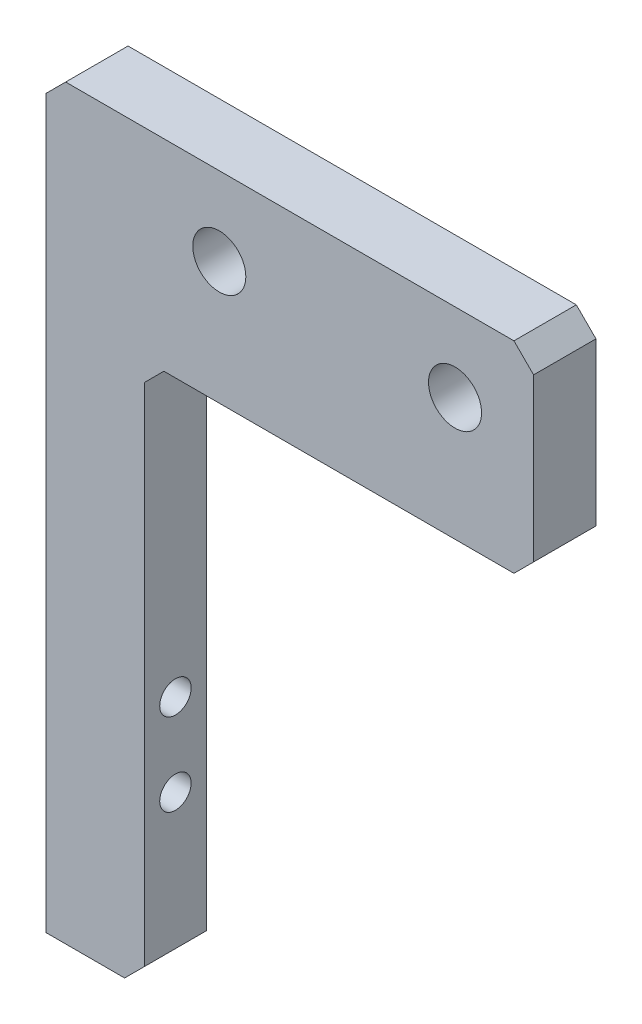
ISO-10303-21;
HEADER;
FILE_DESCRIPTION(('STEP AP214'),'2;1');
FILE_NAME('part.step','',(''),(''),'','','');
FILE_SCHEMA(('AUTOMOTIVE_DESIGN { 1 0 10303 214 1 1 1 1 }'));
ENDSEC;
DATA;
#1=APPLICATION_CONTEXT('core data for automotive mechanical design processes');
#2=APPLICATION_PROTOCOL_DEFINITION('international standard','automotive_design',2000,#1);
#3=PRODUCT_CONTEXT('',#1,'mechanical');
#4=PRODUCT('Part','Part','',(#3));
#5=PRODUCT_RELATED_PRODUCT_CATEGORY('part','',(#4));
#6=PRODUCT_DEFINITION_FORMATION('','',#4);
#7=PRODUCT_DEFINITION_CONTEXT('part definition',#1,'design');
#8=PRODUCT_DEFINITION('design','',#6,#7);
#9=PRODUCT_DEFINITION_SHAPE('','',#8);
#10=(LENGTH_UNIT() NAMED_UNIT(*) SI_UNIT(.MILLI.,.METRE.));
#11=(NAMED_UNIT(*) PLANE_ANGLE_UNIT() SI_UNIT($,.RADIAN.));
#12=(NAMED_UNIT(*) SI_UNIT($,.STERADIAN.) SOLID_ANGLE_UNIT());
#13=UNCERTAINTY_MEASURE_WITH_UNIT(LENGTH_MEASURE(1.E-05),#10,'distance_accuracy_value','');
#14=(GEOMETRIC_REPRESENTATION_CONTEXT(3) GLOBAL_UNCERTAINTY_ASSIGNED_CONTEXT((#13)) GLOBAL_UNIT_ASSIGNED_CONTEXT((#10,
#11,#12)) REPRESENTATION_CONTEXT('',''));
#15=CARTESIAN_POINT('',(0.,0.,0.));
#16=DIRECTION('',(0.,0.,1.));
#17=DIRECTION('',(1.,0.,0.));
#18=AXIS2_PLACEMENT_3D('',#15,#16,#17);
#19=CARTESIAN_POINT('',(-9.81999999999999,-34.,3.175));
#20=DIRECTION('',(-1.,0.,0.));
#21=DIRECTION('',(0.,0.,1.));
#22=AXIS2_PLACEMENT_3D('',#19,#20,#21);
#23=PLANE('',#22);
#24=CARTESIAN_POINT('',(-9.81999999999999,-21.9,1.5875));
#25=DIRECTION('',(-1.,0.,0.));
#26=DIRECTION('',(0.,0.,1.));
#27=AXIS2_PLACEMENT_3D('',#24,#25,#26);
#28=CIRCLE('',#27,0.799999999999997);
#29=CARTESIAN_POINT('',(-9.81999999999999,-21.9,2.3875));
#30=VERTEX_POINT('',#29);
#31=EDGE_CURVE('E286',#30,#30,#28,.T.);
#32=ORIENTED_EDGE('',*,*,#31,.T.);
#33=EDGE_LOOP('',(#32));
#34=FACE_BOUND('',#33,.T.);
#35=CARTESIAN_POINT('',(-9.81999999999999,-26.1,1.5875));
#36=DIRECTION('',(-1.,0.,0.));
#37=DIRECTION('',(0.,0.,1.));
#38=AXIS2_PLACEMENT_3D('',#35,#36,#37);
#39=CIRCLE('',#38,0.799999999999997);
#40=CARTESIAN_POINT('',(-9.81999999999999,-26.1,2.3875));
#41=VERTEX_POINT('',#40);
#42=EDGE_CURVE('E290',#41,#41,#39,.T.);
#43=ORIENTED_EDGE('',*,*,#42,.T.);
#44=EDGE_LOOP('',(#43));
#45=FACE_BOUND('',#44,.T.);
#46=DIRECTION('',(0.,1.,0.));
#47=VECTOR('',#46,1.);
#48=CARTESIAN_POINT('',(-9.81999999999999,-34.,3.175));
#49=LINE('',#48,#47);
#50=CARTESIAN_POINT('',(-9.81999999999999,-33.,3.175));
#51=VERTEX_POINT('',#50);
#52=CARTESIAN_POINT('',(-9.81999999999999,-7.25,3.175));
#53=VERTEX_POINT('',#52);
#54=EDGE_CURVE('E159',#51,#53,#49,.T.);
#55=ORIENTED_EDGE('',*,*,#54,.F.);
#56=DIRECTION('',(0.,0.,-1.));
#57=VECTOR('',#56,1.);
#58=CARTESIAN_POINT('',(-9.81999999999999,-33.,3.175));
#59=LINE('',#58,#57);
#60=CARTESIAN_POINT('',(-9.81999999999999,-33.,0.));
#61=VERTEX_POINT('',#60);
#62=EDGE_CURVE('E162',#51,#61,#59,.T.);
#63=ORIENTED_EDGE('',*,*,#62,.T.);
#64=DIRECTION('',(0.,1.,0.));
#65=VECTOR('',#64,1.);
#66=CARTESIAN_POINT('',(-9.81999999999999,-34.,0.));
#67=LINE('',#66,#65);
#68=CARTESIAN_POINT('',(-9.81999999999999,-7.25,0.));
#69=VERTEX_POINT('',#68);
#70=EDGE_CURVE('E145',#61,#69,#67,.T.);
#71=ORIENTED_EDGE('',*,*,#70,.T.);
#72=DIRECTION('',(0.,0.,1.));
#73=VECTOR('',#72,1.);
#74=CARTESIAN_POINT('',(-9.81999999999999,-7.25,3.175));
#75=LINE('',#74,#73);
#76=EDGE_CURVE('E137',#69,#53,#75,.T.);
#77=ORIENTED_EDGE('',*,*,#76,.T.);
#78=EDGE_LOOP('',(#55,#63,#71,#77));
#79=FACE_BOUND('',#78,.T.);
#80=ADVANCED_FACE('F35',(#34,#45,#79),#23,.F.);
#81=CARTESIAN_POINT('',(-9.81999999999999,-6.25,3.175));
#82=DIRECTION('',(0.,1.,0.));
#83=DIRECTION('',(0.,0.,1.));
#84=AXIS2_PLACEMENT_3D('',#81,#82,#83);
#85=PLANE('',#84);
#86=DIRECTION('',(1.,0.,0.));
#87=VECTOR('',#86,1.);
#88=CARTESIAN_POINT('',(-9.81999999999999,-6.25,3.175));
#89=LINE('',#88,#87);
#90=CARTESIAN_POINT('',(-8.81999999999998,-6.25,3.175));
#91=VERTEX_POINT('',#90);
#92=CARTESIAN_POINT('',(9.,-6.25,3.175));
#93=VERTEX_POINT('',#92);
#94=EDGE_CURVE('E211',#91,#93,#89,.T.);
#95=ORIENTED_EDGE('',*,*,#94,.F.);
#96=DIRECTION('',(0.,0.,-1.));
#97=VECTOR('',#96,1.);
#98=CARTESIAN_POINT('',(-8.81999999999998,-6.25,0.));
#99=LINE('',#98,#97);
#100=CARTESIAN_POINT('',(-8.81999999999998,-6.25,0.));
#101=VERTEX_POINT('',#100);
#102=EDGE_CURVE('E183',#91,#101,#99,.T.);
#103=ORIENTED_EDGE('',*,*,#102,.T.);
#104=DIRECTION('',(1.,0.,0.));
#105=VECTOR('',#104,1.);
#106=CARTESIAN_POINT('',(-9.81999999999999,-6.25,0.));
#107=LINE('',#106,#105);
#108=CARTESIAN_POINT('',(9.,-6.25,0.));
#109=VERTEX_POINT('',#108);
#110=EDGE_CURVE('E148',#101,#109,#107,.T.);
#111=ORIENTED_EDGE('',*,*,#110,.T.);
#112=DIRECTION('',(0.,0.,1.));
#113=VECTOR('',#112,1.);
#114=CARTESIAN_POINT('',(9.,-6.25,3.175));
#115=LINE('',#114,#113);
#116=EDGE_CURVE('E181',#109,#93,#115,.T.);
#117=ORIENTED_EDGE('',*,*,#116,.T.);
#118=EDGE_LOOP('',(#95,#103,#111,#117));
#119=FACE_BOUND('',#118,.T.);
#120=ADVANCED_FACE('F214',(#119),#85,.F.);
#121=CARTESIAN_POINT('',(10.,-6.25,3.175));
#122=DIRECTION('',(-1.,0.,0.));
#123=DIRECTION('',(0.,-1.,0.));
#124=AXIS2_PLACEMENT_3D('',#121,#122,#123);
#125=PLANE('',#124);
#126=DIRECTION('',(0.,1.,0.));
#127=VECTOR('',#126,1.);
#128=CARTESIAN_POINT('',(10.,-6.25,0.));
#129=LINE('',#128,#127);
#130=CARTESIAN_POINT('',(10.,-5.25,0.));
#131=VERTEX_POINT('',#130);
#132=CARTESIAN_POINT('',(10.,3.,0.));
#133=VERTEX_POINT('',#132);
#134=EDGE_CURVE('E152',#131,#133,#129,.T.);
#135=ORIENTED_EDGE('',*,*,#134,.T.);
#136=DIRECTION('',(0.,0.,1.));
#137=VECTOR('',#136,1.);
#138=CARTESIAN_POINT('',(10.,3.,3.175));
#139=LINE('',#138,#137);
#140=CARTESIAN_POINT('',(10.,3.,3.175));
#141=VERTEX_POINT('',#140);
#142=EDGE_CURVE('E195',#133,#141,#139,.T.);
#143=ORIENTED_EDGE('',*,*,#142,.T.);
#144=DIRECTION('',(0.,1.,0.));
#145=VECTOR('',#144,1.);
#146=CARTESIAN_POINT('',(10.,-6.25,3.175));
#147=LINE('',#146,#145);
#148=CARTESIAN_POINT('',(10.,-5.25,3.175));
#149=VERTEX_POINT('',#148);
#150=EDGE_CURVE('E216',#149,#141,#147,.T.);
#151=ORIENTED_EDGE('',*,*,#150,.F.);
#152=DIRECTION('',(0.,0.,-1.));
#153=VECTOR('',#152,1.);
#154=CARTESIAN_POINT('',(10.,-5.25,3.175));
#155=LINE('',#154,#153);
#156=EDGE_CURVE('E192',#149,#131,#155,.T.);
#157=ORIENTED_EDGE('',*,*,#156,.T.);
#158=EDGE_LOOP('',(#135,#143,#151,#157));
#159=FACE_BOUND('',#158,.T.);
#160=ADVANCED_FACE('F247',(#159),#125,.F.);
#161=CARTESIAN_POINT('',(10.,4.,3.175));
#162=DIRECTION('',(0.,-1.,0.));
#163=DIRECTION('',(1.,0.,0.));
#164=AXIS2_PLACEMENT_3D('',#161,#162,#163);
#165=PLANE('',#164);
#166=DIRECTION('',(-1.,0.,0.));
#167=VECTOR('',#166,1.);
#168=CARTESIAN_POINT('',(10.,4.,0.));
#169=LINE('',#168,#167);
#170=CARTESIAN_POINT('',(9.,4.,0.));
#171=VERTEX_POINT('',#170);
#172=CARTESIAN_POINT('',(-13.82,4.,0.));
#173=VERTEX_POINT('',#172);
#174=EDGE_CURVE('E155',#171,#173,#169,.T.);
#175=ORIENTED_EDGE('',*,*,#174,.T.);
#176=DIRECTION('',(0.,0.,1.));
#177=VECTOR('',#176,1.);
#178=CARTESIAN_POINT('',(-13.82,4.,3.175));
#179=LINE('',#178,#177);
#180=CARTESIAN_POINT('',(-13.82,4.,3.175));
#181=VERTEX_POINT('',#180);
#182=EDGE_CURVE('E59',#173,#181,#179,.T.);
#183=ORIENTED_EDGE('',*,*,#182,.T.);
#184=DIRECTION('',(-1.,0.,0.));
#185=VECTOR('',#184,1.);
#186=CARTESIAN_POINT('',(10.,4.,3.175));
#187=LINE('',#186,#185);
#188=CARTESIAN_POINT('',(9.,4.,3.175));
#189=VERTEX_POINT('',#188);
#190=EDGE_CURVE('E127',#189,#181,#187,.T.);
#191=ORIENTED_EDGE('',*,*,#190,.F.);
#192=DIRECTION('',(0.,0.,-1.));
#193=VECTOR('',#192,1.);
#194=CARTESIAN_POINT('',(9.,4.,3.175));
#195=LINE('',#194,#193);
#196=EDGE_CURVE('E188',#189,#171,#195,.T.);
#197=ORIENTED_EDGE('',*,*,#196,.T.);
#198=EDGE_LOOP('',(#175,#183,#191,#197));
#199=FACE_BOUND('',#198,.T.);
#200=ADVANCED_FACE('F254',(#199),#165,.F.);
#201=CARTESIAN_POINT('',(-14.82,4.,3.175));
#202=DIRECTION('',(1.,0.,0.));
#203=DIRECTION('',(0.,1.,0.));
#204=AXIS2_PLACEMENT_3D('',#201,#202,#203);
#205=PLANE('',#204);
#206=CARTESIAN_POINT('',(-14.82,-21.9,1.5875));
#207=DIRECTION('',(-1.,0.,0.));
#208=DIRECTION('',(0.,0.,1.));
#209=AXIS2_PLACEMENT_3D('',#206,#207,#208);
#210=CIRCLE('',#209,0.799999999999999);
#211=CARTESIAN_POINT('',(-14.82,-21.9,2.3875));
#212=VERTEX_POINT('',#211);
#213=EDGE_CURVE('E284',#212,#212,#210,.T.);
#214=ORIENTED_EDGE('',*,*,#213,.F.);
#215=EDGE_LOOP('',(#214));
#216=FACE_BOUND('',#215,.T.);
#217=CARTESIAN_POINT('',(-14.82,-26.1,1.5875));
#218=DIRECTION('',(-1.,0.,0.));
#219=DIRECTION('',(0.,0.,1.));
#220=AXIS2_PLACEMENT_3D('',#217,#218,#219);
#221=CIRCLE('',#220,0.799999999999999);
#222=CARTESIAN_POINT('',(-14.82,-26.1,2.3875));
#223=VERTEX_POINT('',#222);
#224=EDGE_CURVE('E287',#223,#223,#221,.T.);
#225=ORIENTED_EDGE('',*,*,#224,.F.);
#226=EDGE_LOOP('',(#225));
#227=FACE_BOUND('',#226,.T.);
#228=DIRECTION('',(0.,-1.,0.));
#229=VECTOR('',#228,1.);
#230=CARTESIAN_POINT('',(-14.82,4.,3.175));
#231=LINE('',#230,#229);
#232=CARTESIAN_POINT('',(-14.82,3.,3.175));
#233=VERTEX_POINT('',#232);
#234=CARTESIAN_POINT('',(-14.82,-34.,3.175));
#235=VERTEX_POINT('',#234);
#236=EDGE_CURVE('E118',#233,#235,#231,.T.);
#237=ORIENTED_EDGE('',*,*,#236,.F.);
#238=DIRECTION('',(0.,0.,-1.));
#239=VECTOR('',#238,1.);
#240=CARTESIAN_POINT('',(-14.82,3.,3.175));
#241=LINE('',#240,#239);
#242=CARTESIAN_POINT('',(-14.82,3.,0.));
#243=VERTEX_POINT('',#242);
#244=EDGE_CURVE('E186',#233,#243,#241,.T.);
#245=ORIENTED_EDGE('',*,*,#244,.T.);
#246=DIRECTION('',(0.,-1.,0.));
#247=VECTOR('',#246,1.);
#248=CARTESIAN_POINT('',(-14.82,4.,0.));
#249=LINE('',#248,#247);
#250=CARTESIAN_POINT('',(-14.82,-34.,0.));
#251=VERTEX_POINT('',#250);
#252=EDGE_CURVE('E133',#243,#251,#249,.T.);
#253=ORIENTED_EDGE('',*,*,#252,.T.);
#254=DIRECTION('',(0.,0.,-1.));
#255=VECTOR('',#254,1.);
#256=CARTESIAN_POINT('',(-14.82,-34.,3.175));
#257=LINE('',#256,#255);
#258=EDGE_CURVE('E130',#235,#251,#257,.T.);
#259=ORIENTED_EDGE('',*,*,#258,.F.);
#260=EDGE_LOOP('',(#237,#245,#253,#259));
#261=FACE_BOUND('',#260,.T.);
#262=ADVANCED_FACE('F131',(#216,#227,#261),#205,.F.);
#263=CARTESIAN_POINT('',(-14.82,-34.,3.175));
#264=DIRECTION('',(0.,1.,0.));
#265=DIRECTION('',(0.,0.,1.));
#266=AXIS2_PLACEMENT_3D('',#263,#264,#265);
#267=PLANE('',#266);
#268=DIRECTION('',(1.,0.,0.));
#269=VECTOR('',#268,1.);
#270=CARTESIAN_POINT('',(-14.82,-34.,0.));
#271=LINE('',#270,#269);
#272=CARTESIAN_POINT('',(-10.82,-34.,0.));
#273=VERTEX_POINT('',#272);
#274=EDGE_CURVE('E158',#251,#273,#271,.T.);
#275=ORIENTED_EDGE('',*,*,#274,.T.);
#276=DIRECTION('',(0.,0.,1.));
#277=VECTOR('',#276,1.);
#278=CARTESIAN_POINT('',(-10.82,-34.,3.175));
#279=LINE('',#278,#277);
#280=CARTESIAN_POINT('',(-10.82,-34.,3.175));
#281=VERTEX_POINT('',#280);
#282=EDGE_CURVE('E141',#273,#281,#279,.T.);
#283=ORIENTED_EDGE('',*,*,#282,.T.);
#284=DIRECTION('',(1.,0.,0.));
#285=VECTOR('',#284,1.);
#286=CARTESIAN_POINT('',(-14.82,-34.,3.175));
#287=LINE('',#286,#285);
#288=EDGE_CURVE('E122',#235,#281,#287,.T.);
#289=ORIENTED_EDGE('',*,*,#288,.F.);
#290=ORIENTED_EDGE('',*,*,#258,.T.);
#291=EDGE_LOOP('',(#275,#283,#289,#290));
#292=FACE_BOUND('',#291,.T.);
#293=ADVANCED_FACE('F139',(#292),#267,.F.);
#294=CARTESIAN_POINT('',(0.,0.,3.175));
#295=DIRECTION('',(0.,0.,-1.));
#296=DIRECTION('',(-1.,0.,0.));
#297=AXIS2_PLACEMENT_3D('',#294,#295,#296);
#298=PLANE('',#297);
#299=CARTESIAN_POINT('',(-6.,0.,3.175));
#300=DIRECTION('',(0.,0.,1.));
#301=DIRECTION('',(1.,0.,0.));
#302=AXIS2_PLACEMENT_3D('',#299,#300,#301);
#303=CIRCLE('',#302,1.34999999999999);
#304=CARTESIAN_POINT('',(-4.65000000000001,0.,3.175));
#305=VERTEX_POINT('',#304);
#306=EDGE_CURVE('E296',#305,#305,#303,.T.);
#307=ORIENTED_EDGE('',*,*,#306,.F.);
#308=EDGE_LOOP('',(#307));
#309=FACE_BOUND('',#308,.T.);
#310=CARTESIAN_POINT('',(6.,0.,3.175));
#311=DIRECTION('',(0.,0.,1.));
#312=DIRECTION('',(1.,0.,0.));
#313=AXIS2_PLACEMENT_3D('',#310,#311,#312);
#314=CIRCLE('',#313,1.34999999999999);
#315=CARTESIAN_POINT('',(7.34999999999999,0.,3.175));
#316=VERTEX_POINT('',#315);
#317=EDGE_CURVE('E302',#316,#316,#314,.T.);
#318=ORIENTED_EDGE('',*,*,#317,.F.);
#319=EDGE_LOOP('',(#318));
#320=FACE_BOUND('',#319,.T.);
#321=ORIENTED_EDGE('',*,*,#288,.T.);
#322=DIRECTION('',(-0.707106781186552,-0.707106781186543,0.));
#323=VECTOR('',#322,1.);
#324=CARTESIAN_POINT('',(-9.81999999999999,-33.,3.175));
#325=LINE('',#324,#323);
#326=EDGE_CURVE('E179',#281,#51,#325,.F.);
#327=ORIENTED_EDGE('',*,*,#326,.T.);
#328=ORIENTED_EDGE('',*,*,#54,.T.);
#329=DIRECTION('',(-0.707106781186551,-0.707106781186544,0.));
#330=VECTOR('',#329,1.);
#331=CARTESIAN_POINT('',(-1.28499999999995,1.28499999999997,3.175));
#332=LINE('',#331,#330);
#333=EDGE_CURVE('E11',#53,#91,#332,.F.);
#334=ORIENTED_EDGE('',*,*,#333,.T.);
#335=ORIENTED_EDGE('',*,*,#94,.T.);
#336=DIRECTION('',(-0.707106781186548,-0.707106781186548,0.));
#337=VECTOR('',#336,1.);
#338=CARTESIAN_POINT('',(10.,-5.25,3.175));
#339=LINE('',#338,#337);
#340=EDGE_CURVE('E174',#93,#149,#339,.F.);
#341=ORIENTED_EDGE('',*,*,#340,.T.);
#342=ORIENTED_EDGE('',*,*,#150,.T.);
#343=DIRECTION('',(0.707106781186548,-0.707106781186548,0.));
#344=VECTOR('',#343,1.);
#345=CARTESIAN_POINT('',(9.,4.,3.175));
#346=LINE('',#345,#344);
#347=EDGE_CURVE('E176',#141,#189,#346,.F.);
#348=ORIENTED_EDGE('',*,*,#347,.T.);
#349=ORIENTED_EDGE('',*,*,#190,.T.);
#350=DIRECTION('',(0.707106781186548,0.707106781186547,0.));
#351=VECTOR('',#350,1.);
#352=CARTESIAN_POINT('',(-14.82,3.,3.175));
#353=LINE('',#352,#351);
#354=EDGE_CURVE('E51',#181,#233,#353,.F.);
#355=ORIENTED_EDGE('',*,*,#354,.T.);
#356=ORIENTED_EDGE('',*,*,#236,.T.);
#357=EDGE_LOOP('',(#321,#327,#328,#334,#335,#341,#342,#348,#349,#355,#356));
#358=FACE_BOUND('',#357,.T.);
#359=ADVANCED_FACE('F120',(#309,#320,#358),#298,.F.);
#360=CARTESIAN_POINT('',(0.,0.,0.));
#361=DIRECTION('',(0.,0.,-1.));
#362=DIRECTION('',(-1.,0.,0.));
#363=AXIS2_PLACEMENT_3D('',#360,#361,#362);
#364=PLANE('',#363);
#365=CARTESIAN_POINT('',(-6.,0.,0.));
#366=DIRECTION('',(0.,0.,1.));
#367=DIRECTION('',(1.,0.,0.));
#368=AXIS2_PLACEMENT_3D('',#365,#366,#367);
#369=CIRCLE('',#368,1.35);
#370=CARTESIAN_POINT('',(-4.65,0.,0.));
#371=VERTEX_POINT('',#370);
#372=EDGE_CURVE('E299',#371,#371,#369,.T.);
#373=ORIENTED_EDGE('',*,*,#372,.T.);
#374=EDGE_LOOP('',(#373));
#375=FACE_BOUND('',#374,.T.);
#376=CARTESIAN_POINT('',(6.,0.,0.));
#377=DIRECTION('',(0.,0.,1.));
#378=DIRECTION('',(1.,0.,0.));
#379=AXIS2_PLACEMENT_3D('',#376,#377,#378);
#380=CIRCLE('',#379,1.35);
#381=CARTESIAN_POINT('',(7.35,0.,0.));
#382=VERTEX_POINT('',#381);
#383=EDGE_CURVE('E149',#382,#382,#380,.T.);
#384=ORIENTED_EDGE('',*,*,#383,.T.);
#385=EDGE_LOOP('',(#384));
#386=FACE_BOUND('',#385,.T.);
#387=ORIENTED_EDGE('',*,*,#70,.F.);
#388=DIRECTION('',(0.707106781186552,0.707106781186543,0.));
#389=VECTOR('',#388,1.);
#390=CARTESIAN_POINT('',(11.5900000000001,-11.5900000000002,0.));
#391=LINE('',#390,#389);
#392=EDGE_CURVE('E171',#61,#273,#391,.F.);
#393=ORIENTED_EDGE('',*,*,#392,.T.);
#394=ORIENTED_EDGE('',*,*,#274,.F.);
#395=ORIENTED_EDGE('',*,*,#252,.F.);
#396=DIRECTION('',(-0.707106781186548,-0.707106781186547,0.));
#397=VECTOR('',#396,1.);
#398=CARTESIAN_POINT('',(-8.90999999999998,8.91,0.));
#399=LINE('',#398,#397);
#400=EDGE_CURVE('E169',#243,#173,#399,.F.);
#401=ORIENTED_EDGE('',*,*,#400,.T.);
#402=ORIENTED_EDGE('',*,*,#174,.F.);
#403=DIRECTION('',(-0.707106781186548,0.707106781186548,0.));
#404=VECTOR('',#403,1.);
#405=CARTESIAN_POINT('',(6.5,6.5,0.));
#406=LINE('',#405,#404);
#407=EDGE_CURVE('E167',#171,#133,#406,.F.);
#408=ORIENTED_EDGE('',*,*,#407,.T.);
#409=ORIENTED_EDGE('',*,*,#134,.F.);
#410=DIRECTION('',(0.707106781186548,0.707106781186548,0.));
#411=VECTOR('',#410,1.);
#412=CARTESIAN_POINT('',(7.625,-7.625,0.));
#413=LINE('',#412,#411);
#414=EDGE_CURVE('E165',#131,#109,#413,.F.);
#415=ORIENTED_EDGE('',*,*,#414,.T.);
#416=ORIENTED_EDGE('',*,*,#110,.F.);
#417=DIRECTION('',(0.707106781186551,0.707106781186544,0.));
#418=VECTOR('',#417,1.);
#419=CARTESIAN_POINT('',(-8.81999999999998,-6.25,0.));
#420=LINE('',#419,#418);
#421=EDGE_CURVE('E44',#101,#69,#420,.F.);
#422=ORIENTED_EDGE('',*,*,#421,.T.);
#423=EDGE_LOOP('',(#387,#393,#394,#395,#401,#402,#408,#409,#415,#416,#422));
#424=FACE_BOUND('',#423,.T.);
#425=ADVANCED_FACE('F199',(#375,#386,#424),#364,.T.);
#426=CARTESIAN_POINT('',(6.,0.,3.175));
#427=DIRECTION('',(0.,0.,1.));
#428=DIRECTION('',(1.,0.,0.));
#429=AXIS2_PLACEMENT_3D('',#426,#427,#428);
#430=CYLINDRICAL_SURFACE('',#429,1.34999999999999);
#431=ORIENTED_EDGE('',*,*,#383,.F.);
#432=EDGE_LOOP('',(#431));
#433=FACE_BOUND('',#432,.T.);
#434=ORIENTED_EDGE('',*,*,#317,.T.);
#435=EDGE_LOOP('',(#434));
#436=FACE_BOUND('',#435,.T.);
#437=ADVANCED_FACE('F237',(#433,#436),#430,.F.);
#438=CARTESIAN_POINT('',(-6.,0.,3.175));
#439=DIRECTION('',(0.,0.,1.));
#440=DIRECTION('',(1.,0.,0.));
#441=AXIS2_PLACEMENT_3D('',#438,#439,#440);
#442=CYLINDRICAL_SURFACE('',#441,1.34999999999999);
#443=ORIENTED_EDGE('',*,*,#372,.F.);
#444=EDGE_LOOP('',(#443));
#445=FACE_BOUND('',#444,.T.);
#446=ORIENTED_EDGE('',*,*,#306,.T.);
#447=EDGE_LOOP('',(#446));
#448=FACE_BOUND('',#447,.T.);
#449=ADVANCED_FACE('F230',(#445,#448),#442,.F.);
#450=CARTESIAN_POINT('',(-9.81999999999999,-33.,3.175));
#451=DIRECTION('',(-0.707106781186543,0.707106781186552,0.));
#452=DIRECTION('',(0.,0.,-1.));
#453=AXIS2_PLACEMENT_3D('',#450,#451,#452);
#454=PLANE('',#453);
#455=ORIENTED_EDGE('',*,*,#326,.F.);
#456=ORIENTED_EDGE('',*,*,#282,.F.);
#457=ORIENTED_EDGE('',*,*,#392,.F.);
#458=ORIENTED_EDGE('',*,*,#62,.F.);
#459=EDGE_LOOP('',(#455,#456,#457,#458));
#460=FACE_BOUND('',#459,.T.);
#461=ADVANCED_FACE('F228',(#460),#454,.F.);
#462=CARTESIAN_POINT('',(-8.81999999999998,-6.25,3.175));
#463=DIRECTION('',(0.707106781186544,-0.707106781186551,0.));
#464=DIRECTION('',(0.,0.,1.));
#465=AXIS2_PLACEMENT_3D('',#462,#463,#464);
#466=PLANE('',#465);
#467=ORIENTED_EDGE('',*,*,#333,.F.);
#468=ORIENTED_EDGE('',*,*,#76,.F.);
#469=ORIENTED_EDGE('',*,*,#421,.F.);
#470=ORIENTED_EDGE('',*,*,#102,.F.);
#471=EDGE_LOOP('',(#467,#468,#469,#470));
#472=FACE_BOUND('',#471,.T.);
#473=ADVANCED_FACE('F208',(#472),#466,.T.);
#474=CARTESIAN_POINT('',(-14.82,3.,3.175));
#475=DIRECTION('',(0.707106781186547,-0.707106781186548,0.));
#476=DIRECTION('',(0.,0.,-1.));
#477=AXIS2_PLACEMENT_3D('',#474,#475,#476);
#478=PLANE('',#477);
#479=ORIENTED_EDGE('',*,*,#354,.F.);
#480=ORIENTED_EDGE('',*,*,#182,.F.);
#481=ORIENTED_EDGE('',*,*,#400,.F.);
#482=ORIENTED_EDGE('',*,*,#244,.F.);
#483=EDGE_LOOP('',(#479,#480,#481,#482));
#484=FACE_BOUND('',#483,.T.);
#485=ADVANCED_FACE('F225',(#484),#478,.F.);
#486=CARTESIAN_POINT('',(9.,4.,3.175));
#487=DIRECTION('',(-0.707106781186547,-0.707106781186547,0.));
#488=DIRECTION('',(0.,0.,-1.));
#489=AXIS2_PLACEMENT_3D('',#486,#487,#488);
#490=PLANE('',#489);
#491=ORIENTED_EDGE('',*,*,#347,.F.);
#492=ORIENTED_EDGE('',*,*,#142,.F.);
#493=ORIENTED_EDGE('',*,*,#407,.F.);
#494=ORIENTED_EDGE('',*,*,#196,.F.);
#495=EDGE_LOOP('',(#491,#492,#493,#494));
#496=FACE_BOUND('',#495,.T.);
#497=ADVANCED_FACE('F328',(#496),#490,.F.);
#498=CARTESIAN_POINT('',(10.,-5.25,3.175));
#499=DIRECTION('',(-0.707106781186547,0.707106781186547,0.));
#500=DIRECTION('',(0.,0.,-1.));
#501=AXIS2_PLACEMENT_3D('',#498,#499,#500);
#502=PLANE('',#501);
#503=ORIENTED_EDGE('',*,*,#340,.F.);
#504=ORIENTED_EDGE('',*,*,#116,.F.);
#505=ORIENTED_EDGE('',*,*,#414,.F.);
#506=ORIENTED_EDGE('',*,*,#156,.F.);
#507=EDGE_LOOP('',(#503,#504,#505,#506));
#508=FACE_BOUND('',#507,.T.);
#509=ADVANCED_FACE('F38',(#508),#502,.F.);
#510=CARTESIAN_POINT('',(-14.82,-26.1,1.5875));
#511=DIRECTION('',(-1.,0.,0.));
#512=DIRECTION('',(0.,0.,1.));
#513=AXIS2_PLACEMENT_3D('',#510,#511,#512);
#514=CYLINDRICAL_SURFACE('',#513,0.799999999999997);
#515=ORIENTED_EDGE('',*,*,#224,.T.);
#516=EDGE_LOOP('',(#515));
#517=FACE_BOUND('',#516,.T.);
#518=ORIENTED_EDGE('',*,*,#42,.F.);
#519=EDGE_LOOP('',(#518));
#520=FACE_BOUND('',#519,.T.);
#521=ADVANCED_FACE('F272',(#517,#520),#514,.F.);
#522=CARTESIAN_POINT('',(-14.82,-21.9,1.5875));
#523=DIRECTION('',(-1.,0.,0.));
#524=DIRECTION('',(0.,0.,1.));
#525=AXIS2_PLACEMENT_3D('',#522,#523,#524);
#526=CYLINDRICAL_SURFACE('',#525,0.799999999999997);
#527=ORIENTED_EDGE('',*,*,#213,.T.);
#528=EDGE_LOOP('',(#527));
#529=FACE_BOUND('',#528,.T.);
#530=ORIENTED_EDGE('',*,*,#31,.F.);
#531=EDGE_LOOP('',(#530));
#532=FACE_BOUND('',#531,.T.);
#533=ADVANCED_FACE('F275',(#529,#532),#526,.F.);
#534=CLOSED_SHELL('',(#80,#120,#160,#200,#262,#293,#359,#425,#437,#449,#461,#473,#485,#497,#509,
#521,#533));
#535=MANIFOLD_SOLID_BREP('B2',#534);
#536=ADVANCED_BREP_SHAPE_REPRESENTATION('',(#18,#535),#14);
#537=SHAPE_DEFINITION_REPRESENTATION(#9,#536);
ENDSEC;
END-ISO-10303-21;
